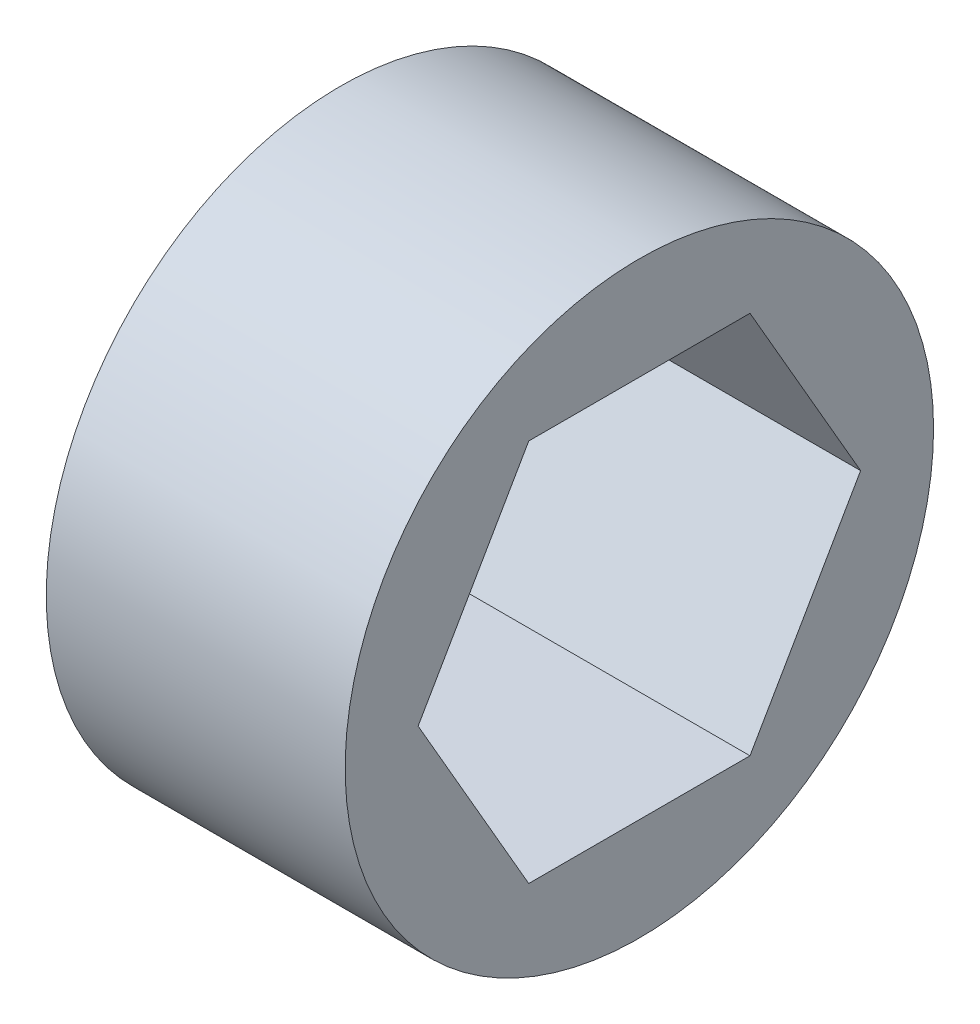
ISO-10303-21;
HEADER;
FILE_DESCRIPTION(('STEP AP214'),'2;1');
FILE_NAME('part.step','',(''),(''),'','','');
FILE_SCHEMA(('AUTOMOTIVE_DESIGN { 1 0 10303 214 1 1 1 1 }'));
ENDSEC;
DATA;
#1=APPLICATION_CONTEXT('core data for automotive mechanical design processes');
#2=APPLICATION_PROTOCOL_DEFINITION('international standard','automotive_design',2000,#1);
#3=PRODUCT_CONTEXT('',#1,'mechanical');
#4=PRODUCT('Part','Part','',(#3));
#5=PRODUCT_RELATED_PRODUCT_CATEGORY('part','',(#4));
#6=PRODUCT_DEFINITION_FORMATION('','',#4);
#7=PRODUCT_DEFINITION_CONTEXT('part definition',#1,'design');
#8=PRODUCT_DEFINITION('design','',#6,#7);
#9=PRODUCT_DEFINITION_SHAPE('','',#8);
#10=(LENGTH_UNIT() NAMED_UNIT(*) SI_UNIT(.MILLI.,.METRE.));
#11=(NAMED_UNIT(*) PLANE_ANGLE_UNIT() SI_UNIT($,.RADIAN.));
#12=(NAMED_UNIT(*) SI_UNIT($,.STERADIAN.) SOLID_ANGLE_UNIT());
#13=UNCERTAINTY_MEASURE_WITH_UNIT(LENGTH_MEASURE(1.E-05),#10,'distance_accuracy_value','');
#14=(GEOMETRIC_REPRESENTATION_CONTEXT(3) GLOBAL_UNCERTAINTY_ASSIGNED_CONTEXT((#13)) GLOBAL_UNIT_ASSIGNED_CONTEXT((#10,
#11,#12)) REPRESENTATION_CONTEXT('',''));
#15=CARTESIAN_POINT('',(0.,0.,0.));
#16=DIRECTION('',(0.,0.,1.));
#17=DIRECTION('',(1.,0.,0.));
#18=AXIS2_PLACEMENT_3D('',#15,#16,#17);
#19=CARTESIAN_POINT('',(9.906,0.,0.));
#20=DIRECTION('',(1.,0.,0.));
#21=DIRECTION('',(0.,0.,-1.));
#22=AXIS2_PLACEMENT_3D('',#19,#20,#21);
#23=PLANE('',#22);
#24=CARTESIAN_POINT('',(9.906,0.,0.));
#25=DIRECTION('',(1.,0.,0.));
#26=DIRECTION('',(0.,0.,-1.));
#27=AXIS2_PLACEMENT_3D('',#24,#25,#26);
#28=CIRCLE('',#27,9.750000058);
#29=CARTESIAN_POINT('',(9.906,0.,-9.750000058));
#30=VERTEX_POINT('',#29);
#31=EDGE_CURVE('E11',#30,#30,#28,.T.);
#32=ORIENTED_EDGE('',*,*,#31,.T.);
#33=EDGE_LOOP('',(#32));
#34=FACE_BOUND('',#33,.T.);
#35=DIRECTION('',(0.,-0.866025403784439,0.5));
#36=VECTOR('',#35,1.);
#37=CARTESIAN_POINT('',(9.906,6.35,3.66617420935412));
#38=LINE('',#37,#36);
#39=CARTESIAN_POINT('',(9.906,6.35,3.66617420935412));
#40=VERTEX_POINT('',#39);
#41=CARTESIAN_POINT('',(9.906,0.,7.33234841870824));
#42=VERTEX_POINT('',#41);
#43=EDGE_CURVE('E95',#40,#42,#38,.T.);
#44=ORIENTED_EDGE('',*,*,#43,.F.);
#45=DIRECTION('',(0.,0.,1.));
#46=VECTOR('',#45,1.);
#47=CARTESIAN_POINT('',(9.906,6.35,-3.66617420935412));
#48=LINE('',#47,#46);
#49=CARTESIAN_POINT('',(9.906,6.35,-3.66617420935412));
#50=VERTEX_POINT('',#49);
#51=EDGE_CURVE('E87',#50,#40,#48,.T.);
#52=ORIENTED_EDGE('',*,*,#51,.F.);
#53=DIRECTION('',(0.,0.866025403784438,0.5));
#54=VECTOR('',#53,1.);
#55=CARTESIAN_POINT('',(9.906,0.,-7.33234841870825));
#56=LINE('',#55,#54);
#57=CARTESIAN_POINT('',(9.906,0.,-7.33234841870825));
#58=VERTEX_POINT('',#57);
#59=EDGE_CURVE('E115',#58,#50,#56,.T.);
#60=ORIENTED_EDGE('',*,*,#59,.F.);
#61=DIRECTION('',(0.,0.866025403784439,-0.499999999999999));
#62=VECTOR('',#61,1.);
#63=CARTESIAN_POINT('',(9.906,-6.35,-3.66617420935413));
#64=LINE('',#63,#62);
#65=CARTESIAN_POINT('',(9.906,-6.35,-3.66617420935413));
#66=VERTEX_POINT('',#65);
#67=EDGE_CURVE('E113',#66,#58,#64,.T.);
#68=ORIENTED_EDGE('',*,*,#67,.F.);
#69=DIRECTION('',(0.,0.,-1.));
#70=VECTOR('',#69,1.);
#71=CARTESIAN_POINT('',(9.906,-6.35,3.66617420935412));
#72=LINE('',#71,#70);
#73=CARTESIAN_POINT('',(9.906,-6.35,3.66617420935412));
#74=VERTEX_POINT('',#73);
#75=EDGE_CURVE('E109',#74,#66,#72,.T.);
#76=ORIENTED_EDGE('',*,*,#75,.F.);
#77=DIRECTION('',(0.,-0.866025403784438,-0.5));
#78=VECTOR('',#77,1.);
#79=CARTESIAN_POINT('',(9.906,0.,7.33234841870824));
#80=LINE('',#79,#78);
#81=EDGE_CURVE('E107',#42,#74,#80,.T.);
#82=ORIENTED_EDGE('',*,*,#81,.F.);
#83=EDGE_LOOP('',(#44,#52,#60,#68,#76,#82));
#84=FACE_BOUND('',#83,.T.);
#85=ADVANCED_FACE('F34',(#34,#84),#23,.T.);
#86=CARTESIAN_POINT('',(0.,0.,0.));
#87=DIRECTION('',(1.,0.,0.));
#88=DIRECTION('',(0.,0.,-1.));
#89=AXIS2_PLACEMENT_3D('',#86,#87,#88);
#90=PLANE('',#89);
#91=CARTESIAN_POINT('',(0.,0.,0.));
#92=DIRECTION('',(1.,0.,0.));
#93=DIRECTION('',(0.,0.,-1.));
#94=AXIS2_PLACEMENT_3D('',#91,#92,#93);
#95=CIRCLE('',#94,9.750000058);
#96=CARTESIAN_POINT('',(0.,0.,-9.750000058));
#97=VERTEX_POINT('',#96);
#98=EDGE_CURVE('E38',#97,#97,#95,.T.);
#99=ORIENTED_EDGE('',*,*,#98,.F.);
#100=EDGE_LOOP('',(#99));
#101=FACE_BOUND('',#100,.T.);
#102=DIRECTION('',(0.,0.,1.));
#103=VECTOR('',#102,1.);
#104=CARTESIAN_POINT('',(0.,6.35,-3.66617420935412));
#105=LINE('',#104,#103);
#106=CARTESIAN_POINT('',(0.,6.35,-3.66617420935412));
#107=VERTEX_POINT('',#106);
#108=CARTESIAN_POINT('',(0.,6.35,3.66617420935412));
#109=VERTEX_POINT('',#108);
#110=EDGE_CURVE('E57',#107,#109,#105,.T.);
#111=ORIENTED_EDGE('',*,*,#110,.T.);
#112=DIRECTION('',(0.,-0.866025403784439,0.5));
#113=VECTOR('',#112,1.);
#114=CARTESIAN_POINT('',(0.,6.35,3.66617420935412));
#115=LINE('',#114,#113);
#116=CARTESIAN_POINT('',(0.,0.,7.33234841870824));
#117=VERTEX_POINT('',#116);
#118=EDGE_CURVE('E102',#109,#117,#115,.T.);
#119=ORIENTED_EDGE('',*,*,#118,.T.);
#120=DIRECTION('',(0.,-0.866025403784438,-0.5));
#121=VECTOR('',#120,1.);
#122=CARTESIAN_POINT('',(0.,0.,7.33234841870824));
#123=LINE('',#122,#121);
#124=CARTESIAN_POINT('',(0.,-6.35,3.66617420935412));
#125=VERTEX_POINT('',#124);
#126=EDGE_CURVE('E119',#117,#125,#123,.T.);
#127=ORIENTED_EDGE('',*,*,#126,.T.);
#128=DIRECTION('',(0.,0.,-1.));
#129=VECTOR('',#128,1.);
#130=CARTESIAN_POINT('',(0.,-6.35,3.66617420935412));
#131=LINE('',#130,#129);
#132=CARTESIAN_POINT('',(0.,-6.35,-3.66617420935413));
#133=VERTEX_POINT('',#132);
#134=EDGE_CURVE('E122',#125,#133,#131,.T.);
#135=ORIENTED_EDGE('',*,*,#134,.T.);
#136=DIRECTION('',(0.,0.866025403784439,-0.499999999999999));
#137=VECTOR('',#136,1.);
#138=CARTESIAN_POINT('',(0.,-6.35,-3.66617420935413));
#139=LINE('',#138,#137);
#140=CARTESIAN_POINT('',(0.,0.,-7.33234841870825));
#141=VERTEX_POINT('',#140);
#142=EDGE_CURVE('E125',#133,#141,#139,.T.);
#143=ORIENTED_EDGE('',*,*,#142,.T.);
#144=DIRECTION('',(0.,0.866025403784438,0.5));
#145=VECTOR('',#144,1.);
#146=CARTESIAN_POINT('',(0.,0.,-7.33234841870825));
#147=LINE('',#146,#145);
#148=EDGE_CURVE('E96',#141,#107,#147,.T.);
#149=ORIENTED_EDGE('',*,*,#148,.T.);
#150=EDGE_LOOP('',(#111,#119,#127,#135,#143,#149));
#151=FACE_BOUND('',#150,.T.);
#152=ADVANCED_FACE('F142',(#101,#151),#90,.F.);
#153=CARTESIAN_POINT('',(9.906,0.,0.));
#154=DIRECTION('',(-1.,0.,0.));
#155=DIRECTION('',(0.,0.,1.));
#156=AXIS2_PLACEMENT_3D('',#153,#154,#155);
#157=CYLINDRICAL_SURFACE('',#156,9.750000058);
#158=ORIENTED_EDGE('',*,*,#31,.F.);
#159=EDGE_LOOP('',(#158));
#160=FACE_BOUND('',#159,.T.);
#161=ORIENTED_EDGE('',*,*,#98,.T.);
#162=EDGE_LOOP('',(#161));
#163=FACE_BOUND('',#162,.T.);
#164=ADVANCED_FACE('F36',(#160,#163),#157,.T.);
#165=CARTESIAN_POINT('',(9.906,6.35,-3.66617420935412));
#166=DIRECTION('',(0.,-1.,0.));
#167=DIRECTION('',(0.,0.,-1.));
#168=AXIS2_PLACEMENT_3D('',#165,#166,#167);
#169=PLANE('',#168);
#170=ORIENTED_EDGE('',*,*,#110,.F.);
#171=DIRECTION('',(-1.,0.,0.));
#172=VECTOR('',#171,1.);
#173=CARTESIAN_POINT('',(9.906,6.35,-3.66617420935412));
#174=LINE('',#173,#172);
#175=EDGE_CURVE('E91',#50,#107,#174,.T.);
#176=ORIENTED_EDGE('',*,*,#175,.F.);
#177=ORIENTED_EDGE('',*,*,#51,.T.);
#178=DIRECTION('',(-1.,0.,0.));
#179=VECTOR('',#178,1.);
#180=CARTESIAN_POINT('',(9.906,6.35,3.66617420935412));
#181=LINE('',#180,#179);
#182=EDGE_CURVE('E90',#40,#109,#181,.T.);
#183=ORIENTED_EDGE('',*,*,#182,.T.);
#184=EDGE_LOOP('',(#170,#176,#177,#183));
#185=FACE_BOUND('',#184,.T.);
#186=ADVANCED_FACE('F89',(#185),#169,.T.);
#187=CARTESIAN_POINT('',(9.906,6.35,3.66617420935412));
#188=DIRECTION('',(0.,-0.5,-0.866025403784439));
#189=DIRECTION('',(0.,0.866025403784439,-0.5));
#190=AXIS2_PLACEMENT_3D('',#187,#188,#189);
#191=PLANE('',#190);
#192=ORIENTED_EDGE('',*,*,#118,.F.);
#193=ORIENTED_EDGE('',*,*,#182,.F.);
#194=ORIENTED_EDGE('',*,*,#43,.T.);
#195=DIRECTION('',(-1.,0.,0.));
#196=VECTOR('',#195,1.);
#197=CARTESIAN_POINT('',(9.906,0.,7.33234841870824));
#198=LINE('',#197,#196);
#199=EDGE_CURVE('E103',#42,#117,#198,.T.);
#200=ORIENTED_EDGE('',*,*,#199,.T.);
#201=EDGE_LOOP('',(#192,#193,#194,#200));
#202=FACE_BOUND('',#201,.T.);
#203=ADVANCED_FACE('F99',(#202),#191,.T.);
#204=CARTESIAN_POINT('',(9.906,0.,7.33234841870824));
#205=DIRECTION('',(0.,0.5,-0.866025403784438));
#206=DIRECTION('',(0.,0.866025403784439,0.5));
#207=AXIS2_PLACEMENT_3D('',#204,#205,#206);
#208=PLANE('',#207);
#209=ORIENTED_EDGE('',*,*,#126,.F.);
#210=ORIENTED_EDGE('',*,*,#199,.F.);
#211=ORIENTED_EDGE('',*,*,#81,.T.);
#212=DIRECTION('',(-1.,0.,0.));
#213=VECTOR('',#212,1.);
#214=CARTESIAN_POINT('',(9.906,-6.35,3.66617420935412));
#215=LINE('',#214,#213);
#216=EDGE_CURVE('E134',#74,#125,#215,.T.);
#217=ORIENTED_EDGE('',*,*,#216,.T.);
#218=EDGE_LOOP('',(#209,#210,#211,#217));
#219=FACE_BOUND('',#218,.T.);
#220=ADVANCED_FACE('F138',(#219),#208,.T.);
#221=CARTESIAN_POINT('',(9.906,-6.35,3.66617420935412));
#222=DIRECTION('',(0.,1.,0.));
#223=DIRECTION('',(0.,0.,1.));
#224=AXIS2_PLACEMENT_3D('',#221,#222,#223);
#225=PLANE('',#224);
#226=ORIENTED_EDGE('',*,*,#134,.F.);
#227=ORIENTED_EDGE('',*,*,#216,.F.);
#228=ORIENTED_EDGE('',*,*,#75,.T.);
#229=DIRECTION('',(-1.,0.,0.));
#230=VECTOR('',#229,1.);
#231=CARTESIAN_POINT('',(9.906,-6.35,-3.66617420935413));
#232=LINE('',#231,#230);
#233=EDGE_CURVE('E132',#66,#133,#232,.T.);
#234=ORIENTED_EDGE('',*,*,#233,.T.);
#235=EDGE_LOOP('',(#226,#227,#228,#234));
#236=FACE_BOUND('',#235,.T.);
#237=ADVANCED_FACE('F150',(#236),#225,.T.);
#238=CARTESIAN_POINT('',(9.906,-6.35,-3.66617420935413));
#239=DIRECTION('',(0.,0.499999999999999,0.866025403784439));
#240=DIRECTION('',(0.,-0.866025403784439,0.499999999999999));
#241=AXIS2_PLACEMENT_3D('',#238,#239,#240);
#242=PLANE('',#241);
#243=ORIENTED_EDGE('',*,*,#142,.F.);
#244=ORIENTED_EDGE('',*,*,#233,.F.);
#245=ORIENTED_EDGE('',*,*,#67,.T.);
#246=DIRECTION('',(-1.,0.,0.));
#247=VECTOR('',#246,1.);
#248=CARTESIAN_POINT('',(9.906,0.,-7.33234841870825));
#249=LINE('',#248,#247);
#250=EDGE_CURVE('E49',#58,#141,#249,.T.);
#251=ORIENTED_EDGE('',*,*,#250,.T.);
#252=EDGE_LOOP('',(#243,#244,#245,#251));
#253=FACE_BOUND('',#252,.T.);
#254=ADVANCED_FACE('F148',(#253),#242,.T.);
#255=CARTESIAN_POINT('',(9.906,0.,-7.33234841870825));
#256=DIRECTION('',(0.,-0.5,0.866025403784438));
#257=DIRECTION('',(0.,-0.866025403784439,-0.5));
#258=AXIS2_PLACEMENT_3D('',#255,#256,#257);
#259=PLANE('',#258);
#260=ORIENTED_EDGE('',*,*,#148,.F.);
#261=ORIENTED_EDGE('',*,*,#250,.F.);
#262=ORIENTED_EDGE('',*,*,#59,.T.);
#263=ORIENTED_EDGE('',*,*,#175,.T.);
#264=EDGE_LOOP('',(#260,#261,#262,#263));
#265=FACE_BOUND('',#264,.T.);
#266=ADVANCED_FACE('F144',(#265),#259,.T.);
#267=CLOSED_SHELL('',(#85,#152,#164,#186,#203,#220,#237,#254,#266));
#268=MANIFOLD_SOLID_BREP('B2',#267);
#269=ADVANCED_BREP_SHAPE_REPRESENTATION('',(#18,#268),#14);
#270=SHAPE_DEFINITION_REPRESENTATION(#9,#269);
ENDSEC;
END-ISO-10303-21;
